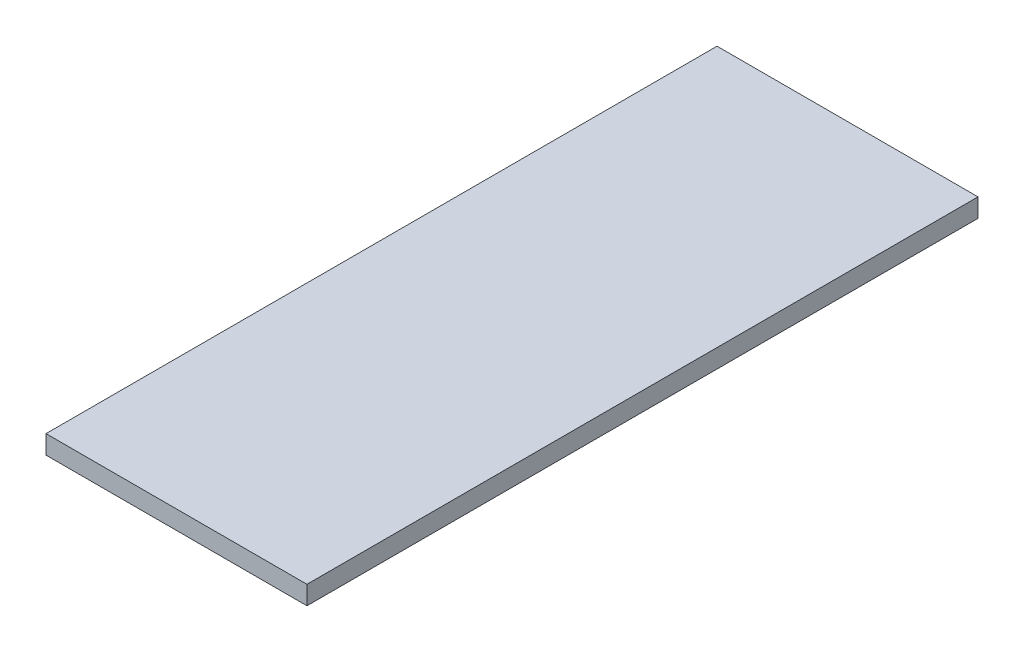
ISO-10303-21;
HEADER;
FILE_DESCRIPTION(('STEP AP214'),'2;1');
FILE_NAME('part.step','',(''),(''),'','','');
FILE_SCHEMA(('AUTOMOTIVE_DESIGN { 1 0 10303 214 1 1 1 1 }'));
ENDSEC;
DATA;
#1=APPLICATION_CONTEXT('core data for automotive mechanical design processes');
#2=APPLICATION_PROTOCOL_DEFINITION('international standard','automotive_design',2000,#1);
#3=PRODUCT_CONTEXT('',#1,'mechanical');
#4=PRODUCT('Part','Part','',(#3));
#5=PRODUCT_RELATED_PRODUCT_CATEGORY('part','',(#4));
#6=PRODUCT_DEFINITION_FORMATION('','',#4);
#7=PRODUCT_DEFINITION_CONTEXT('part definition',#1,'design');
#8=PRODUCT_DEFINITION('design','',#6,#7);
#9=PRODUCT_DEFINITION_SHAPE('','',#8);
#10=(LENGTH_UNIT() NAMED_UNIT(*) SI_UNIT(.MILLI.,.METRE.));
#11=(NAMED_UNIT(*) PLANE_ANGLE_UNIT() SI_UNIT($,.RADIAN.));
#12=(NAMED_UNIT(*) SI_UNIT($,.STERADIAN.) SOLID_ANGLE_UNIT());
#13=UNCERTAINTY_MEASURE_WITH_UNIT(LENGTH_MEASURE(1.E-05),#10,'distance_accuracy_value','');
#14=(GEOMETRIC_REPRESENTATION_CONTEXT(3) GLOBAL_UNCERTAINTY_ASSIGNED_CONTEXT((#13)) GLOBAL_UNIT_ASSIGNED_CONTEXT((#10,
#11,#12)) REPRESENTATION_CONTEXT('',''));
#15=CARTESIAN_POINT('',(0.,0.,0.));
#16=DIRECTION('',(0.,0.,1.));
#17=DIRECTION('',(1.,0.,0.));
#18=AXIS2_PLACEMENT_3D('',#15,#16,#17);
#19=CARTESIAN_POINT('',(35.,5.,90.));
#20=DIRECTION('',(-1.,0.,0.));
#21=DIRECTION('',(0.,0.,1.));
#22=AXIS2_PLACEMENT_3D('',#19,#20,#21);
#23=PLANE('',#22);
#24=DIRECTION('',(0.,0.,-1.));
#25=VECTOR('',#24,1.);
#26=CARTESIAN_POINT('',(35.,0.,90.));
#27=LINE('',#26,#25);
#28=CARTESIAN_POINT('',(35.,0.,90.));
#29=VERTEX_POINT('',#28);
#30=CARTESIAN_POINT('',(35.,0.,-90.));
#31=VERTEX_POINT('',#30);
#32=EDGE_CURVE('E102',#29,#31,#27,.T.);
#33=ORIENTED_EDGE('',*,*,#32,.T.);
#34=DIRECTION('',(0.,-1.,0.));
#35=VECTOR('',#34,1.);
#36=CARTESIAN_POINT('',(35.,5.,-90.));
#37=LINE('',#36,#35);
#38=CARTESIAN_POINT('',(35.,5.,-90.));
#39=VERTEX_POINT('',#38);
#40=EDGE_CURVE('E11',#39,#31,#37,.T.);
#41=ORIENTED_EDGE('',*,*,#40,.F.);
#42=DIRECTION('',(0.,0.,-1.));
#43=VECTOR('',#42,1.);
#44=CARTESIAN_POINT('',(35.,5.,90.));
#45=LINE('',#44,#43);
#46=CARTESIAN_POINT('',(35.,5.,90.));
#47=VERTEX_POINT('',#46);
#48=EDGE_CURVE('E90',#47,#39,#45,.T.);
#49=ORIENTED_EDGE('',*,*,#48,.F.);
#50=DIRECTION('',(0.,-1.,0.));
#51=VECTOR('',#50,1.);
#52=CARTESIAN_POINT('',(35.,5.,90.));
#53=LINE('',#52,#51);
#54=EDGE_CURVE('E98',#47,#29,#53,.T.);
#55=ORIENTED_EDGE('',*,*,#54,.T.);
#56=EDGE_LOOP('',(#33,#41,#49,#55));
#57=FACE_BOUND('',#56,.T.);
#58=ADVANCED_FACE('F39',(#57),#23,.F.);
#59=CARTESIAN_POINT('',(-35.,5.,-90.));
#60=DIRECTION('',(0.,0.,1.));
#61=DIRECTION('',(1.,0.,0.));
#62=AXIS2_PLACEMENT_3D('',#59,#60,#61);
#63=PLANE('',#62);
#64=DIRECTION('',(-1.,0.,0.));
#65=VECTOR('',#64,1.);
#66=CARTESIAN_POINT('',(-35.,0.,-90.));
#67=LINE('',#66,#65);
#68=CARTESIAN_POINT('',(-35.,0.,-90.));
#69=VERTEX_POINT('',#68);
#70=EDGE_CURVE('E94',#31,#69,#67,.T.);
#71=ORIENTED_EDGE('',*,*,#70,.T.);
#72=DIRECTION('',(0.,-1.,0.));
#73=VECTOR('',#72,1.);
#74=CARTESIAN_POINT('',(-35.,5.,-90.));
#75=LINE('',#74,#73);
#76=CARTESIAN_POINT('',(-35.,5.,-90.));
#77=VERTEX_POINT('',#76);
#78=EDGE_CURVE('E47',#77,#69,#75,.T.);
#79=ORIENTED_EDGE('',*,*,#78,.F.);
#80=DIRECTION('',(-1.,0.,0.));
#81=VECTOR('',#80,1.);
#82=CARTESIAN_POINT('',(-35.,5.,-90.));
#83=LINE('',#82,#81);
#84=EDGE_CURVE('E85',#39,#77,#83,.T.);
#85=ORIENTED_EDGE('',*,*,#84,.F.);
#86=ORIENTED_EDGE('',*,*,#40,.T.);
#87=EDGE_LOOP('',(#71,#79,#85,#86));
#88=FACE_BOUND('',#87,.T.);
#89=ADVANCED_FACE('F93',(#88),#63,.F.);
#90=CARTESIAN_POINT('',(-35.,5.,90.));
#91=DIRECTION('',(1.,0.,0.));
#92=DIRECTION('',(0.,0.,-1.));
#93=AXIS2_PLACEMENT_3D('',#90,#91,#92);
#94=PLANE('',#93);
#95=DIRECTION('',(0.,0.,1.));
#96=VECTOR('',#95,1.);
#97=CARTESIAN_POINT('',(-35.,0.,90.));
#98=LINE('',#97,#96);
#99=CARTESIAN_POINT('',(-35.,0.,90.));
#100=VERTEX_POINT('',#99);
#101=EDGE_CURVE('E72',#69,#100,#98,.T.);
#102=ORIENTED_EDGE('',*,*,#101,.T.);
#103=DIRECTION('',(0.,-1.,0.));
#104=VECTOR('',#103,1.);
#105=CARTESIAN_POINT('',(-35.,5.,90.));
#106=LINE('',#105,#104);
#107=CARTESIAN_POINT('',(-35.,5.,90.));
#108=VERTEX_POINT('',#107);
#109=EDGE_CURVE('E95',#108,#100,#106,.T.);
#110=ORIENTED_EDGE('',*,*,#109,.F.);
#111=DIRECTION('',(0.,0.,1.));
#112=VECTOR('',#111,1.);
#113=CARTESIAN_POINT('',(-35.,5.,90.));
#114=LINE('',#113,#112);
#115=EDGE_CURVE('E88',#77,#108,#114,.T.);
#116=ORIENTED_EDGE('',*,*,#115,.F.);
#117=ORIENTED_EDGE('',*,*,#78,.T.);
#118=EDGE_LOOP('',(#102,#110,#116,#117));
#119=FACE_BOUND('',#118,.T.);
#120=ADVANCED_FACE('F96',(#119),#94,.F.);
#121=CARTESIAN_POINT('',(-35.,5.,90.));
#122=DIRECTION('',(0.,0.,-1.));
#123=DIRECTION('',(-1.,0.,0.));
#124=AXIS2_PLACEMENT_3D('',#121,#122,#123);
#125=PLANE('',#124);
#126=DIRECTION('',(1.,0.,0.));
#127=VECTOR('',#126,1.);
#128=CARTESIAN_POINT('',(-35.,0.,90.));
#129=LINE('',#128,#127);
#130=EDGE_CURVE('E78',#100,#29,#129,.T.);
#131=ORIENTED_EDGE('',*,*,#130,.T.);
#132=ORIENTED_EDGE('',*,*,#54,.F.);
#133=DIRECTION('',(1.,0.,0.));
#134=VECTOR('',#133,1.);
#135=CARTESIAN_POINT('',(-35.,5.,90.));
#136=LINE('',#135,#134);
#137=EDGE_CURVE('E55',#108,#47,#136,.T.);
#138=ORIENTED_EDGE('',*,*,#137,.F.);
#139=ORIENTED_EDGE('',*,*,#109,.T.);
#140=EDGE_LOOP('',(#131,#132,#138,#139));
#141=FACE_BOUND('',#140,.T.);
#142=ADVANCED_FACE('F110',(#141),#125,.F.);
#143=CARTESIAN_POINT('',(0.,5.,0.));
#144=DIRECTION('',(0.,-1.,0.));
#145=DIRECTION('',(0.,0.,-1.));
#146=AXIS2_PLACEMENT_3D('',#143,#144,#145);
#147=PLANE('',#146);
#148=ORIENTED_EDGE('',*,*,#48,.T.);
#149=ORIENTED_EDGE('',*,*,#84,.T.);
#150=ORIENTED_EDGE('',*,*,#115,.T.);
#151=ORIENTED_EDGE('',*,*,#137,.T.);
#152=EDGE_LOOP('',(#148,#149,#150,#151));
#153=FACE_BOUND('',#152,.T.);
#154=ADVANCED_FACE('F86',(#153),#147,.F.);
#155=CARTESIAN_POINT('',(0.,0.,0.));
#156=DIRECTION('',(0.,-1.,0.));
#157=DIRECTION('',(0.,0.,-1.));
#158=AXIS2_PLACEMENT_3D('',#155,#156,#157);
#159=PLANE('',#158);
#160=CARTESIAN_POINT('',(29.8955471875893,0.,84.5690794303333));
#161=DIRECTION('',(0.,-1.,0.));
#162=DIRECTION('',(0.,0.,-1.));
#163=AXIS2_PLACEMENT_3D('',#160,#161,#162);
#164=CIRCLE('',#163,4.00000000000001);
#165=CARTESIAN_POINT('',(29.8955471875893,0.,80.5690794303333));
#166=VERTEX_POINT('',#165);
#167=EDGE_CURVE('E119',#166,#166,#164,.T.);
#168=ORIENTED_EDGE('',*,*,#167,.F.);
#169=EDGE_LOOP('',(#168));
#170=FACE_BOUND('',#169,.T.);
#171=CARTESIAN_POINT('',(-30.,0.,-85.));
#172=DIRECTION('',(0.,-1.,0.));
#173=DIRECTION('',(0.,0.,-1.));
#174=AXIS2_PLACEMENT_3D('',#171,#172,#173);
#175=CIRCLE('',#174,4.);
#176=CARTESIAN_POINT('',(-30.,0.,-89.));
#177=VERTEX_POINT('',#176);
#178=EDGE_CURVE('E125',#177,#177,#175,.T.);
#179=ORIENTED_EDGE('',*,*,#178,.F.);
#180=EDGE_LOOP('',(#179));
#181=FACE_BOUND('',#180,.T.);
#182=CARTESIAN_POINT('',(29.8955471875893,0.,-85.));
#183=DIRECTION('',(0.,-1.,0.));
#184=DIRECTION('',(0.,0.,-1.));
#185=AXIS2_PLACEMENT_3D('',#182,#183,#184);
#186=CIRCLE('',#185,4.00000000000001);
#187=CARTESIAN_POINT('',(29.8955471875893,0.,-89.));
#188=VERTEX_POINT('',#187);
#189=EDGE_CURVE('E126',#188,#188,#186,.T.);
#190=ORIENTED_EDGE('',*,*,#189,.F.);
#191=EDGE_LOOP('',(#190));
#192=FACE_BOUND('',#191,.T.);
#193=CARTESIAN_POINT('',(-30.,0.,84.5690794303333));
#194=DIRECTION('',(0.,-1.,0.));
#195=DIRECTION('',(0.,0.,-1.));
#196=AXIS2_PLACEMENT_3D('',#193,#194,#195);
#197=CIRCLE('',#196,4.);
#198=CARTESIAN_POINT('',(-30.,0.,80.5690794303333));
#199=VERTEX_POINT('',#198);
#200=EDGE_CURVE('E116',#199,#199,#197,.T.);
#201=ORIENTED_EDGE('',*,*,#200,.F.);
#202=EDGE_LOOP('',(#201));
#203=FACE_BOUND('',#202,.T.);
#204=ORIENTED_EDGE('',*,*,#32,.F.);
#205=ORIENTED_EDGE('',*,*,#130,.F.);
#206=ORIENTED_EDGE('',*,*,#101,.F.);
#207=ORIENTED_EDGE('',*,*,#70,.F.);
#208=EDGE_LOOP('',(#204,#205,#206,#207));
#209=FACE_BOUND('',#208,.T.);
#210=ADVANCED_FACE('F113',(#170,#181,#192,#203,#209),#159,.T.);
#211=CARTESIAN_POINT('',(-30.,2.,84.5690794303333));
#212=DIRECTION('',(0.,-1.,0.));
#213=DIRECTION('',(0.,0.,-1.));
#214=AXIS2_PLACEMENT_3D('',#211,#212,#213);
#215=CYLINDRICAL_SURFACE('',#214,4.);
#216=CARTESIAN_POINT('',(-30.,2.,84.5690794303333));
#217=DIRECTION('',(0.,-1.,0.));
#218=DIRECTION('',(0.,0.,-1.));
#219=AXIS2_PLACEMENT_3D('',#216,#217,#218);
#220=CIRCLE('',#219,4.);
#221=CARTESIAN_POINT('',(-30.,2.,80.5690794303333));
#222=VERTEX_POINT('',#221);
#223=EDGE_CURVE('E105',#222,#222,#220,.T.);
#224=ORIENTED_EDGE('',*,*,#223,.F.);
#225=EDGE_LOOP('',(#224));
#226=FACE_BOUND('',#225,.T.);
#227=ORIENTED_EDGE('',*,*,#200,.T.);
#228=EDGE_LOOP('',(#227));
#229=FACE_BOUND('',#228,.T.);
#230=ADVANCED_FACE('F144',(#226,#229),#215,.F.);
#231=CARTESIAN_POINT('',(-30.,2.,84.5690794303333));
#232=DIRECTION('',(0.,-1.,0.));
#233=DIRECTION('',(0.,0.,-1.));
#234=AXIS2_PLACEMENT_3D('',#231,#232,#233);
#235=PLANE('',#234);
#236=ORIENTED_EDGE('',*,*,#223,.T.);
#237=EDGE_LOOP('',(#236));
#238=FACE_BOUND('',#237,.T.);
#239=ADVANCED_FACE('F150',(#238),#235,.T.);
#240=CARTESIAN_POINT('',(29.8955471875893,2.,-85.));
#241=DIRECTION('',(0.,-1.,0.));
#242=DIRECTION('',(0.,0.,-1.));
#243=AXIS2_PLACEMENT_3D('',#240,#241,#242);
#244=CYLINDRICAL_SURFACE('',#243,4.00000000000001);
#245=CARTESIAN_POINT('',(29.8955471875893,2.,-85.));
#246=DIRECTION('',(0.,-1.,0.));
#247=DIRECTION('',(0.,0.,-1.));
#248=AXIS2_PLACEMENT_3D('',#245,#246,#247);
#249=CIRCLE('',#248,4.00000000000001);
#250=CARTESIAN_POINT('',(29.8955471875893,2.,-89.));
#251=VERTEX_POINT('',#250);
#252=EDGE_CURVE('E134',#251,#251,#249,.T.);
#253=ORIENTED_EDGE('',*,*,#252,.F.);
#254=EDGE_LOOP('',(#253));
#255=FACE_BOUND('',#254,.T.);
#256=ORIENTED_EDGE('',*,*,#189,.T.);
#257=EDGE_LOOP('',(#256));
#258=FACE_BOUND('',#257,.T.);
#259=ADVANCED_FACE('F140',(#255,#258),#244,.F.);
#260=CARTESIAN_POINT('',(29.8955471875893,2.,-85.));
#261=DIRECTION('',(0.,-1.,0.));
#262=DIRECTION('',(0.,0.,-1.));
#263=AXIS2_PLACEMENT_3D('',#260,#261,#262);
#264=PLANE('',#263);
#265=ORIENTED_EDGE('',*,*,#252,.T.);
#266=EDGE_LOOP('',(#265));
#267=FACE_BOUND('',#266,.T.);
#268=ADVANCED_FACE('F200',(#267),#264,.T.);
#269=CARTESIAN_POINT('',(-30.,2.,-85.));
#270=DIRECTION('',(0.,-1.,0.));
#271=DIRECTION('',(0.,0.,-1.));
#272=AXIS2_PLACEMENT_3D('',#269,#270,#271);
#273=CYLINDRICAL_SURFACE('',#272,4.);
#274=CARTESIAN_POINT('',(-30.,2.,-85.));
#275=DIRECTION('',(0.,-1.,0.));
#276=DIRECTION('',(0.,0.,-1.));
#277=AXIS2_PLACEMENT_3D('',#274,#275,#276);
#278=CIRCLE('',#277,4.);
#279=CARTESIAN_POINT('',(-30.,2.,-89.));
#280=VERTEX_POINT('',#279);
#281=EDGE_CURVE('E122',#280,#280,#278,.T.);
#282=ORIENTED_EDGE('',*,*,#281,.F.);
#283=EDGE_LOOP('',(#282));
#284=FACE_BOUND('',#283,.T.);
#285=ORIENTED_EDGE('',*,*,#178,.T.);
#286=EDGE_LOOP('',(#285));
#287=FACE_BOUND('',#286,.T.);
#288=ADVANCED_FACE('F210',(#284,#287),#273,.F.);
#289=CARTESIAN_POINT('',(-30.,2.,-85.));
#290=DIRECTION('',(0.,-1.,0.));
#291=DIRECTION('',(0.,0.,-1.));
#292=AXIS2_PLACEMENT_3D('',#289,#290,#291);
#293=PLANE('',#292);
#294=ORIENTED_EDGE('',*,*,#281,.T.);
#295=EDGE_LOOP('',(#294));
#296=FACE_BOUND('',#295,.T.);
#297=ADVANCED_FACE('F220',(#296),#293,.T.);
#298=CARTESIAN_POINT('',(29.8955471875893,2.,84.5690794303333));
#299=DIRECTION('',(0.,-1.,0.));
#300=DIRECTION('',(0.,0.,-1.));
#301=AXIS2_PLACEMENT_3D('',#298,#299,#300);
#302=CYLINDRICAL_SURFACE('',#301,4.00000000000001);
#303=CARTESIAN_POINT('',(29.8955471875893,2.,84.5690794303333));
#304=DIRECTION('',(0.,-1.,0.));
#305=DIRECTION('',(0.,0.,-1.));
#306=AXIS2_PLACEMENT_3D('',#303,#304,#305);
#307=CIRCLE('',#306,4.00000000000001);
#308=CARTESIAN_POINT('',(29.8955471875893,2.,80.5690794303333));
#309=VERTEX_POINT('',#308);
#310=EDGE_CURVE('E129',#309,#309,#307,.T.);
#311=ORIENTED_EDGE('',*,*,#310,.F.);
#312=EDGE_LOOP('',(#311));
#313=FACE_BOUND('',#312,.T.);
#314=ORIENTED_EDGE('',*,*,#167,.T.);
#315=EDGE_LOOP('',(#314));
#316=FACE_BOUND('',#315,.T.);
#317=ADVANCED_FACE('F230',(#313,#316),#302,.F.);
#318=CARTESIAN_POINT('',(29.8955471875893,2.,84.5690794303333));
#319=DIRECTION('',(0.,-1.,0.));
#320=DIRECTION('',(0.,0.,-1.));
#321=AXIS2_PLACEMENT_3D('',#318,#319,#320);
#322=PLANE('',#321);
#323=ORIENTED_EDGE('',*,*,#310,.T.);
#324=EDGE_LOOP('',(#323));
#325=FACE_BOUND('',#324,.T.);
#326=ADVANCED_FACE('F240',(#325),#322,.T.);
#327=CLOSED_SHELL('',(#58,#89,#120,#142,#154,#210,#230,#239,#259,#268,#288,#297,#317,#326));
#328=MANIFOLD_SOLID_BREP('B2',#327);
#329=ADVANCED_BREP_SHAPE_REPRESENTATION('',(#18,#328),#14);
#330=SHAPE_DEFINITION_REPRESENTATION(#9,#329);
ENDSEC;
END-ISO-10303-21;
